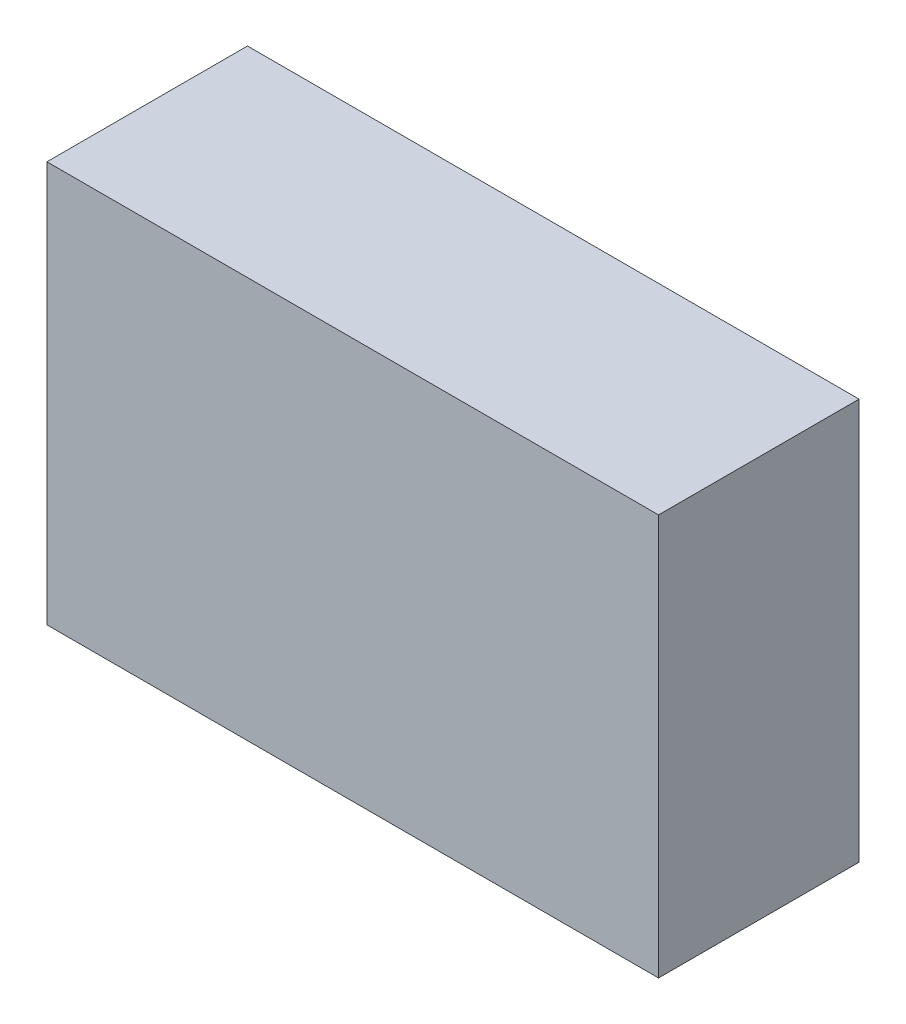
ISO-10303-21;
HEADER;
FILE_DESCRIPTION(('STEP AP214'),'2;1');
FILE_NAME('part.step','',(''),(''),'','','');
FILE_SCHEMA(('AUTOMOTIVE_DESIGN { 1 0 10303 214 1 1 1 1 }'));
ENDSEC;
DATA;
#1=APPLICATION_CONTEXT('core data for automotive mechanical design processes');
#2=APPLICATION_PROTOCOL_DEFINITION('international standard','automotive_design',2000,#1);
#3=PRODUCT_CONTEXT('',#1,'mechanical');
#4=PRODUCT('Part','Part','',(#3));
#5=PRODUCT_RELATED_PRODUCT_CATEGORY('part','',(#4));
#6=PRODUCT_DEFINITION_FORMATION('','',#4);
#7=PRODUCT_DEFINITION_CONTEXT('part definition',#1,'design');
#8=PRODUCT_DEFINITION('design','',#6,#7);
#9=PRODUCT_DEFINITION_SHAPE('','',#8);
#10=(LENGTH_UNIT() NAMED_UNIT(*) SI_UNIT(.MILLI.,.METRE.));
#11=(NAMED_UNIT(*) PLANE_ANGLE_UNIT() SI_UNIT($,.RADIAN.));
#12=(NAMED_UNIT(*) SI_UNIT($,.STERADIAN.) SOLID_ANGLE_UNIT());
#13=UNCERTAINTY_MEASURE_WITH_UNIT(LENGTH_MEASURE(1.E-05),#10,'distance_accuracy_value','');
#14=(GEOMETRIC_REPRESENTATION_CONTEXT(3) GLOBAL_UNCERTAINTY_ASSIGNED_CONTEXT((#13)) GLOBAL_UNIT_ASSIGNED_CONTEXT((#10,
#11,#12)) REPRESENTATION_CONTEXT('',''));
#15=CARTESIAN_POINT('',(0.,0.,0.));
#16=DIRECTION('',(0.,0.,1.));
#17=DIRECTION('',(1.,0.,0.));
#18=AXIS2_PLACEMENT_3D('',#15,#16,#17);
#19=CARTESIAN_POINT('',(31.347247706422,40.,12.2809633027523));
#20=DIRECTION('',(-1.,0.,0.));
#21=DIRECTION('',(0.,0.,1.));
#22=AXIS2_PLACEMENT_3D('',#19,#20,#21);
#23=PLANE('',#22);
#24=DIRECTION('',(0.,0.,-1.));
#25=VECTOR('',#24,1.);
#26=CARTESIAN_POINT('',(31.347247706422,0.,12.2809633027523));
#27=LINE('',#26,#25);
#28=CARTESIAN_POINT('',(31.347247706422,0.,12.2809633027523));
#29=VERTEX_POINT('',#28);
#30=CARTESIAN_POINT('',(31.347247706422,0.,-7.71903669724771));
#31=VERTEX_POINT('',#30);
#32=EDGE_CURVE('E111',#29,#31,#27,.T.);
#33=ORIENTED_EDGE('',*,*,#32,.T.);
#34=DIRECTION('',(0.,-1.,0.));
#35=VECTOR('',#34,1.);
#36=CARTESIAN_POINT('',(31.347247706422,40.,-7.71903669724771));
#37=LINE('',#36,#35);
#38=CARTESIAN_POINT('',(31.347247706422,40.,-7.71903669724771));
#39=VERTEX_POINT('',#38);
#40=EDGE_CURVE('E11',#39,#31,#37,.T.);
#41=ORIENTED_EDGE('',*,*,#40,.F.);
#42=DIRECTION('',(0.,0.,-1.));
#43=VECTOR('',#42,1.);
#44=CARTESIAN_POINT('',(31.347247706422,40.,12.2809633027523));
#45=LINE('',#44,#43);
#46=CARTESIAN_POINT('',(31.347247706422,40.,12.2809633027523));
#47=VERTEX_POINT('',#46);
#48=EDGE_CURVE('E95',#47,#39,#45,.T.);
#49=ORIENTED_EDGE('',*,*,#48,.F.);
#50=DIRECTION('',(0.,-1.,0.));
#51=VECTOR('',#50,1.);
#52=CARTESIAN_POINT('',(31.347247706422,40.,12.2809633027523));
#53=LINE('',#52,#51);
#54=EDGE_CURVE('E107',#47,#29,#53,.T.);
#55=ORIENTED_EDGE('',*,*,#54,.T.);
#56=EDGE_LOOP('',(#33,#41,#49,#55));
#57=FACE_BOUND('',#56,.T.);
#58=ADVANCED_FACE('F43',(#57),#23,.F.);
#59=CARTESIAN_POINT('',(31.347247706422,40.,-7.71903669724771));
#60=DIRECTION('',(0.,0.,1.));
#61=DIRECTION('',(1.,0.,0.));
#62=AXIS2_PLACEMENT_3D('',#59,#60,#61);
#63=PLANE('',#62);
#64=DIRECTION('',(-1.,0.,0.));
#65=VECTOR('',#64,1.);
#66=CARTESIAN_POINT('',(31.347247706422,0.,-7.71903669724771));
#67=LINE('',#66,#65);
#68=CARTESIAN_POINT('',(-29.652752293578,0.,-7.7190366972477));
#69=VERTEX_POINT('',#68);
#70=EDGE_CURVE('E100',#31,#69,#67,.T.);
#71=ORIENTED_EDGE('',*,*,#70,.T.);
#72=DIRECTION('',(0.,-1.,0.));
#73=VECTOR('',#72,1.);
#74=CARTESIAN_POINT('',(-29.652752293578,40.,-7.7190366972477));
#75=LINE('',#74,#73);
#76=CARTESIAN_POINT('',(-29.652752293578,40.,-7.7190366972477));
#77=VERTEX_POINT('',#76);
#78=EDGE_CURVE('E52',#77,#69,#75,.T.);
#79=ORIENTED_EDGE('',*,*,#78,.F.);
#80=DIRECTION('',(-1.,0.,0.));
#81=VECTOR('',#80,1.);
#82=CARTESIAN_POINT('',(31.347247706422,40.,-7.71903669724771));
#83=LINE('',#82,#81);
#84=EDGE_CURVE('E90',#39,#77,#83,.T.);
#85=ORIENTED_EDGE('',*,*,#84,.F.);
#86=ORIENTED_EDGE('',*,*,#40,.T.);
#87=EDGE_LOOP('',(#71,#79,#85,#86));
#88=FACE_BOUND('',#87,.T.);
#89=ADVANCED_FACE('F99',(#88),#63,.F.);
#90=CARTESIAN_POINT('',(-29.652752293578,40.,12.2809633027523));
#91=DIRECTION('',(1.,0.,0.));
#92=DIRECTION('',(0.,0.,-1.));
#93=AXIS2_PLACEMENT_3D('',#90,#91,#92);
#94=PLANE('',#93);
#95=DIRECTION('',(0.,0.,1.));
#96=VECTOR('',#95,1.);
#97=CARTESIAN_POINT('',(-29.652752293578,0.,12.2809633027523));
#98=LINE('',#97,#96);
#99=CARTESIAN_POINT('',(-29.652752293578,0.,12.2809633027523));
#100=VERTEX_POINT('',#99);
#101=EDGE_CURVE('E77',#69,#100,#98,.T.);
#102=ORIENTED_EDGE('',*,*,#101,.T.);
#103=DIRECTION('',(0.,-1.,0.));
#104=VECTOR('',#103,1.);
#105=CARTESIAN_POINT('',(-29.652752293578,40.,12.2809633027523));
#106=LINE('',#105,#104);
#107=CARTESIAN_POINT('',(-29.652752293578,40.,12.2809633027523));
#108=VERTEX_POINT('',#107);
#109=EDGE_CURVE('E102',#108,#100,#106,.T.);
#110=ORIENTED_EDGE('',*,*,#109,.F.);
#111=DIRECTION('',(0.,0.,1.));
#112=VECTOR('',#111,1.);
#113=CARTESIAN_POINT('',(-29.652752293578,40.,12.2809633027523));
#114=LINE('',#113,#112);
#115=EDGE_CURVE('E93',#77,#108,#114,.T.);
#116=ORIENTED_EDGE('',*,*,#115,.F.);
#117=ORIENTED_EDGE('',*,*,#78,.T.);
#118=EDGE_LOOP('',(#102,#110,#116,#117));
#119=FACE_BOUND('',#118,.T.);
#120=ADVANCED_FACE('F103',(#119),#94,.F.);
#121=CARTESIAN_POINT('',(31.347247706422,40.,12.2809633027523));
#122=DIRECTION('',(0.,0.,-1.));
#123=DIRECTION('',(-1.,0.,0.));
#124=AXIS2_PLACEMENT_3D('',#121,#122,#123);
#125=PLANE('',#124);
#126=DIRECTION('',(1.,0.,0.));
#127=VECTOR('',#126,1.);
#128=CARTESIAN_POINT('',(31.347247706422,0.,12.2809633027523));
#129=LINE('',#128,#127);
#130=EDGE_CURVE('E83',#100,#29,#129,.T.);
#131=ORIENTED_EDGE('',*,*,#130,.T.);
#132=ORIENTED_EDGE('',*,*,#54,.F.);
#133=DIRECTION('',(1.,0.,0.));
#134=VECTOR('',#133,1.);
#135=CARTESIAN_POINT('',(31.347247706422,40.,12.2809633027523));
#136=LINE('',#135,#134);
#137=EDGE_CURVE('E60',#108,#47,#136,.T.);
#138=ORIENTED_EDGE('',*,*,#137,.F.);
#139=ORIENTED_EDGE('',*,*,#109,.T.);
#140=EDGE_LOOP('',(#131,#132,#138,#139));
#141=FACE_BOUND('',#140,.T.);
#142=ADVANCED_FACE('F124',(#141),#125,.F.);
#143=CARTESIAN_POINT('',(0.,40.,0.));
#144=DIRECTION('',(0.,1.,0.));
#145=DIRECTION('',(0.,0.,1.));
#146=AXIS2_PLACEMENT_3D('',#143,#144,#145);
#147=PLANE('',#146);
#148=ORIENTED_EDGE('',*,*,#48,.T.);
#149=ORIENTED_EDGE('',*,*,#84,.T.);
#150=ORIENTED_EDGE('',*,*,#115,.T.);
#151=ORIENTED_EDGE('',*,*,#137,.T.);
#152=EDGE_LOOP('',(#148,#149,#150,#151));
#153=FACE_BOUND('',#152,.T.);
#154=ADVANCED_FACE('F91',(#153),#147,.T.);
#155=CARTESIAN_POINT('',(0.,0.,0.));
#156=DIRECTION('',(0.,1.,0.));
#157=DIRECTION('',(0.,0.,1.));
#158=AXIS2_PLACEMENT_3D('',#155,#156,#157);
#159=PLANE('',#158);
#160=ORIENTED_EDGE('',*,*,#32,.F.);
#161=ORIENTED_EDGE('',*,*,#130,.F.);
#162=ORIENTED_EDGE('',*,*,#101,.F.);
#163=ORIENTED_EDGE('',*,*,#70,.F.);
#164=EDGE_LOOP('',(#160,#161,#162,#163));
#165=FACE_BOUND('',#164,.T.);
#166=ADVANCED_FACE('F127',(#165),#159,.F.);
#167=CLOSED_SHELL('',(#58,#89,#120,#142,#154,#166));
#168=MANIFOLD_SOLID_BREP('B2',#167);
#169=ADVANCED_BREP_SHAPE_REPRESENTATION('',(#18,#168),#14);
#170=SHAPE_DEFINITION_REPRESENTATION(#9,#169);
ENDSEC;
END-ISO-10303-21;
